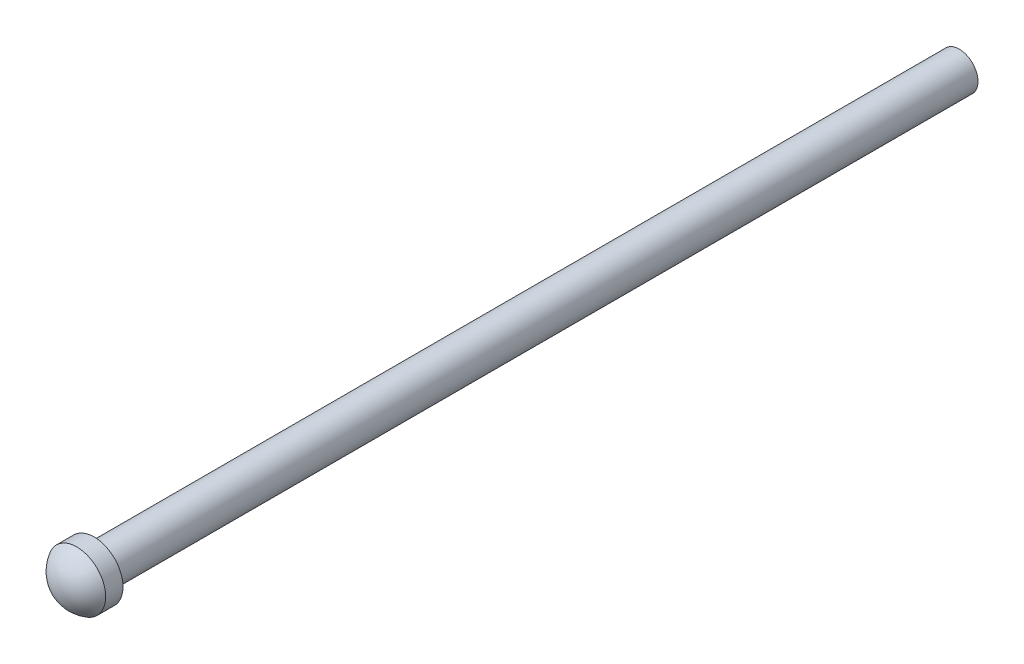
ISO-10303-21;
HEADER;
FILE_DESCRIPTION(('STEP AP214'),'2;1');
FILE_NAME('part.step','',(''),(''),'','','');
FILE_SCHEMA(('AUTOMOTIVE_DESIGN { 1 0 10303 214 1 1 1 1 }'));
ENDSEC;
DATA;
#1=APPLICATION_CONTEXT('core data for automotive mechanical design processes');
#2=APPLICATION_PROTOCOL_DEFINITION('international standard','automotive_design',2000,#1);
#3=PRODUCT_CONTEXT('',#1,'mechanical');
#4=PRODUCT('Part','Part','',(#3));
#5=PRODUCT_RELATED_PRODUCT_CATEGORY('part','',(#4));
#6=PRODUCT_DEFINITION_FORMATION('','',#4);
#7=PRODUCT_DEFINITION_CONTEXT('part definition',#1,'design');
#8=PRODUCT_DEFINITION('design','',#6,#7);
#9=PRODUCT_DEFINITION_SHAPE('','',#8);
#10=(LENGTH_UNIT() NAMED_UNIT(*) SI_UNIT(.MILLI.,.METRE.));
#11=(NAMED_UNIT(*) PLANE_ANGLE_UNIT() SI_UNIT($,.RADIAN.));
#12=(NAMED_UNIT(*) SI_UNIT($,.STERADIAN.) SOLID_ANGLE_UNIT());
#13=UNCERTAINTY_MEASURE_WITH_UNIT(LENGTH_MEASURE(1.E-05),#10,'distance_accuracy_value','');
#14=(GEOMETRIC_REPRESENTATION_CONTEXT(3) GLOBAL_UNCERTAINTY_ASSIGNED_CONTEXT((#13)) GLOBAL_UNIT_ASSIGNED_CONTEXT((#10,
#11,#12)) REPRESENTATION_CONTEXT('',''));
#15=CARTESIAN_POINT('',(0.,0.,0.));
#16=DIRECTION('',(0.,0.,1.));
#17=DIRECTION('',(1.,0.,0.));
#18=AXIS2_PLACEMENT_3D('',#15,#16,#17);
#19=CARTESIAN_POINT('',(5.,60.,-150.));
#20=DIRECTION('',(0.,0.,1.));
#21=DIRECTION('',(1.,0.,0.));
#22=AXIS2_PLACEMENT_3D('',#19,#20,#21);
#23=PLANE('',#22);
#24=CARTESIAN_POINT('',(5.,60.,-150.));
#25=DIRECTION('',(0.,0.,1.));
#26=DIRECTION('',(1.,0.,0.));
#27=AXIS2_PLACEMENT_3D('',#24,#25,#26);
#28=CIRCLE('',#27,3.25);
#29=CARTESIAN_POINT('',(8.25,60.,-150.));
#30=VERTEX_POINT('',#29);
#31=EDGE_CURVE('E11',#30,#30,#28,.T.);
#32=ORIENTED_EDGE('',*,*,#31,.F.);
#33=EDGE_LOOP('',(#32));
#34=FACE_BOUND('',#33,.T.);
#35=ADVANCED_FACE('F38',(#34),#23,.F.);
#36=CARTESIAN_POINT('',(5.,60.,0.));
#37=DIRECTION('',(0.,0.,-1.));
#38=DIRECTION('',(-1.,0.,0.));
#39=AXIS2_PLACEMENT_3D('',#36,#37,#38);
#40=CYLINDRICAL_SURFACE('',#39,3.25);
#41=ORIENTED_EDGE('',*,*,#31,.T.);
#42=EDGE_LOOP('',(#41));
#43=FACE_BOUND('',#42,.T.);
#44=CARTESIAN_POINT('',(5.,60.,0.));
#45=DIRECTION('',(0.,0.,1.));
#46=DIRECTION('',(1.,0.,0.));
#47=AXIS2_PLACEMENT_3D('',#44,#45,#46);
#48=CIRCLE('',#47,3.25);
#49=CARTESIAN_POINT('',(8.25,60.,0.));
#50=VERTEX_POINT('',#49);
#51=EDGE_CURVE('E46',#50,#50,#48,.T.);
#52=ORIENTED_EDGE('',*,*,#51,.F.);
#53=EDGE_LOOP('',(#52));
#54=FACE_BOUND('',#53,.T.);
#55=ADVANCED_FACE('F49',(#43,#54),#40,.T.);
#56=CARTESIAN_POINT('',(5.,60.,3.));
#57=DIRECTION('',(0.,0.,-1.));
#58=DIRECTION('',(-1.,0.,0.));
#59=AXIS2_PLACEMENT_3D('',#56,#57,#58);
#60=CYLINDRICAL_SURFACE('',#59,5.);
#61=CARTESIAN_POINT('',(5.,60.,3.));
#62=DIRECTION('',(0.,0.,1.));
#63=DIRECTION('',(1.,0.,0.));
#64=AXIS2_PLACEMENT_3D('',#61,#62,#63);
#65=CIRCLE('',#64,5.);
#66=CARTESIAN_POINT('',(10.,60.,3.));
#67=VERTEX_POINT('',#66);
#68=EDGE_CURVE('E42',#67,#67,#65,.T.);
#69=ORIENTED_EDGE('',*,*,#68,.F.);
#70=EDGE_LOOP('',(#69));
#71=FACE_BOUND('',#70,.T.);
#72=CARTESIAN_POINT('',(5.,60.,0.));
#73=DIRECTION('',(0.,0.,1.));
#74=DIRECTION('',(1.,0.,0.));
#75=AXIS2_PLACEMENT_3D('',#72,#73,#74);
#76=CIRCLE('',#75,5.);
#77=CARTESIAN_POINT('',(10.,60.,0.));
#78=VERTEX_POINT('',#77);
#79=EDGE_CURVE('E78',#78,#78,#76,.T.);
#80=ORIENTED_EDGE('',*,*,#79,.T.);
#81=EDGE_LOOP('',(#80));
#82=FACE_BOUND('',#81,.T.);
#83=ADVANCED_FACE('F53',(#71,#82),#60,.T.);
#84=CARTESIAN_POINT('',(5.,60.,0.333333333333334));
#85=DIRECTION('',(0.,0.,1.));
#86=DIRECTION('',(1.,0.,0.));
#87=AXIS2_PLACEMENT_3D('',#84,#85,#86);
#88=SPHERICAL_SURFACE('',#87,5.66666666666667);
#89=ORIENTED_EDGE('',*,*,#68,.T.);
#90=EDGE_LOOP('',(#89));
#91=FACE_BOUND('',#90,.T.);
#92=ADVANCED_FACE('F40',(#91),#88,.T.);
#93=CARTESIAN_POINT('',(5.,60.,0.));
#94=DIRECTION('',(0.,0.,1.));
#95=DIRECTION('',(1.,0.,0.));
#96=AXIS2_PLACEMENT_3D('',#93,#94,#95);
#97=PLANE('',#96);
#98=ORIENTED_EDGE('',*,*,#51,.T.);
#99=EDGE_LOOP('',(#98));
#100=FACE_BOUND('',#99,.T.);
#101=ORIENTED_EDGE('',*,*,#79,.F.);
#102=EDGE_LOOP('',(#101));
#103=FACE_BOUND('',#102,.T.);
#104=ADVANCED_FACE('F64',(#100,#103),#97,.F.);
#105=CLOSED_SHELL('',(#35,#55,#83,#92,#104));
#106=MANIFOLD_SOLID_BREP('B2',#105);
#107=ADVANCED_BREP_SHAPE_REPRESENTATION('',(#18,#106),#14);
#108=SHAPE_DEFINITION_REPRESENTATION(#9,#107);
ENDSEC;
END-ISO-10303-21;
